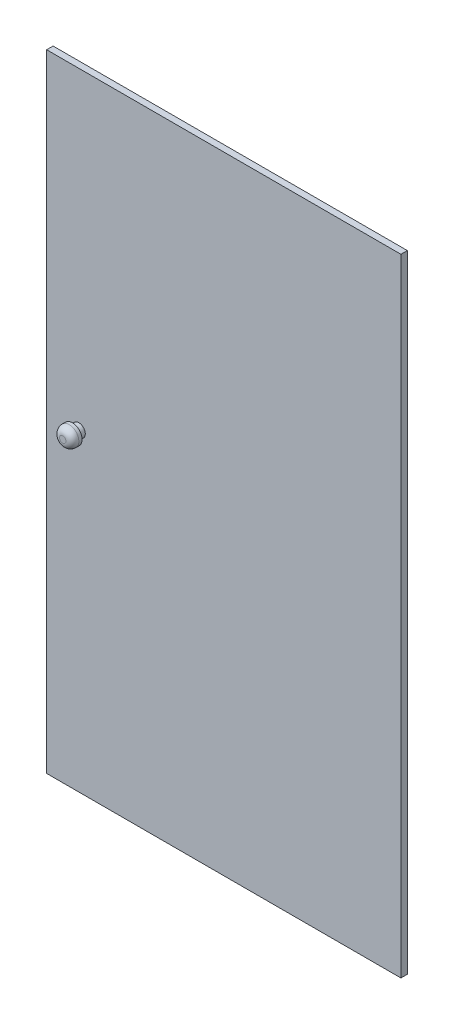
ISO-10303-21;
HEADER;
FILE_DESCRIPTION(('STEP AP214'),'2;1');
FILE_NAME('part.step','',(''),(''),'','','');
FILE_SCHEMA(('AUTOMOTIVE_DESIGN { 1 0 10303 214 1 1 1 1 }'));
ENDSEC;
DATA;
#1=APPLICATION_CONTEXT('core data for automotive mechanical design processes');
#2=APPLICATION_PROTOCOL_DEFINITION('international standard','automotive_design',2000,#1);
#3=PRODUCT_CONTEXT('',#1,'mechanical');
#4=PRODUCT('Part','Part','',(#3));
#5=PRODUCT_RELATED_PRODUCT_CATEGORY('part','',(#4));
#6=PRODUCT_DEFINITION_FORMATION('','',#4);
#7=PRODUCT_DEFINITION_CONTEXT('part definition',#1,'design');
#8=PRODUCT_DEFINITION('design','',#6,#7);
#9=PRODUCT_DEFINITION_SHAPE('','',#8);
#10=(LENGTH_UNIT() NAMED_UNIT(*) SI_UNIT(.MILLI.,.METRE.));
#11=(NAMED_UNIT(*) PLANE_ANGLE_UNIT() SI_UNIT($,.RADIAN.));
#12=(NAMED_UNIT(*) SI_UNIT($,.STERADIAN.) SOLID_ANGLE_UNIT());
#13=UNCERTAINTY_MEASURE_WITH_UNIT(LENGTH_MEASURE(1.E-05),#10,'distance_accuracy_value','');
#14=(GEOMETRIC_REPRESENTATION_CONTEXT(3) GLOBAL_UNCERTAINTY_ASSIGNED_CONTEXT((#13)) GLOBAL_UNIT_ASSIGNED_CONTEXT((#10,
#11,#12)) REPRESENTATION_CONTEXT('',''));
#15=CARTESIAN_POINT('',(0.,0.,0.));
#16=DIRECTION('',(0.,0.,1.));
#17=DIRECTION('',(1.,0.,0.));
#18=AXIS2_PLACEMENT_3D('',#15,#16,#17);
#19=CARTESIAN_POINT('',(-275.,-486.5,10.));
#20=DIRECTION('',(1.,0.,0.));
#21=DIRECTION('',(0.,0.,-1.));
#22=AXIS2_PLACEMENT_3D('',#19,#20,#21);
#23=PLANE('',#22);
#24=DIRECTION('',(0.,-1.,0.));
#25=VECTOR('',#24,1.);
#26=CARTESIAN_POINT('',(-275.,-486.5,0.));
#27=LINE('',#26,#25);
#28=CARTESIAN_POINT('',(-275.,486.5,0.));
#29=VERTEX_POINT('',#28);
#30=CARTESIAN_POINT('',(-275.,-486.5,0.));
#31=VERTEX_POINT('',#30);
#32=EDGE_CURVE('E102',#29,#31,#27,.T.);
#33=ORIENTED_EDGE('',*,*,#32,.T.);
#34=DIRECTION('',(0.,0.,-1.));
#35=VECTOR('',#34,1.);
#36=CARTESIAN_POINT('',(-275.,-486.5,10.));
#37=LINE('',#36,#35);
#38=CARTESIAN_POINT('',(-275.,-486.5,10.));
#39=VERTEX_POINT('',#38);
#40=EDGE_CURVE('E93',#39,#31,#37,.T.);
#41=ORIENTED_EDGE('',*,*,#40,.F.);
#42=DIRECTION('',(0.,-1.,0.));
#43=VECTOR('',#42,1.);
#44=CARTESIAN_POINT('',(-275.,-486.5,10.));
#45=LINE('',#44,#43);
#46=CARTESIAN_POINT('',(-275.,486.5,10.));
#47=VERTEX_POINT('',#46);
#48=EDGE_CURVE('E87',#47,#39,#45,.T.);
#49=ORIENTED_EDGE('',*,*,#48,.F.);
#50=DIRECTION('',(0.,0.,-1.));
#51=VECTOR('',#50,1.);
#52=CARTESIAN_POINT('',(-275.,486.5,10.));
#53=LINE('',#52,#51);
#54=EDGE_CURVE('E98',#47,#29,#53,.T.);
#55=ORIENTED_EDGE('',*,*,#54,.T.);
#56=EDGE_LOOP('',(#33,#41,#49,#55));
#57=FACE_BOUND('',#56,.T.);
#58=ADVANCED_FACE('F34',(#57),#23,.F.);
#59=CARTESIAN_POINT('',(275.,-486.5,10.));
#60=DIRECTION('',(0.,1.,0.));
#61=DIRECTION('',(-1.,0.,0.));
#62=AXIS2_PLACEMENT_3D('',#59,#60,#61);
#63=PLANE('',#62);
#64=DIRECTION('',(1.,0.,0.));
#65=VECTOR('',#64,1.);
#66=CARTESIAN_POINT('',(275.,-486.5,0.));
#67=LINE('',#66,#65);
#68=CARTESIAN_POINT('',(275.,-486.5,0.));
#69=VERTEX_POINT('',#68);
#70=EDGE_CURVE('E92',#31,#69,#67,.T.);
#71=ORIENTED_EDGE('',*,*,#70,.T.);
#72=DIRECTION('',(0.,0.,-1.));
#73=VECTOR('',#72,1.);
#74=CARTESIAN_POINT('',(275.,-486.5,10.));
#75=LINE('',#74,#73);
#76=CARTESIAN_POINT('',(275.,-486.5,10.));
#77=VERTEX_POINT('',#76);
#78=EDGE_CURVE('E90',#77,#69,#75,.T.);
#79=ORIENTED_EDGE('',*,*,#78,.F.);
#80=DIRECTION('',(1.,0.,0.));
#81=VECTOR('',#80,1.);
#82=CARTESIAN_POINT('',(275.,-486.5,10.));
#83=LINE('',#82,#81);
#84=EDGE_CURVE('E82',#39,#77,#83,.T.);
#85=ORIENTED_EDGE('',*,*,#84,.F.);
#86=ORIENTED_EDGE('',*,*,#40,.T.);
#87=EDGE_LOOP('',(#71,#79,#85,#86));
#88=FACE_BOUND('',#87,.T.);
#89=ADVANCED_FACE('F91',(#88),#63,.F.);
#90=CARTESIAN_POINT('',(275.,-486.5,10.));
#91=DIRECTION('',(-1.,0.,0.));
#92=DIRECTION('',(0.,0.,1.));
#93=AXIS2_PLACEMENT_3D('',#90,#91,#92);
#94=PLANE('',#93);
#95=DIRECTION('',(0.,1.,0.));
#96=VECTOR('',#95,1.);
#97=CARTESIAN_POINT('',(275.,-486.5,0.));
#98=LINE('',#97,#96);
#99=CARTESIAN_POINT('',(275.,486.5,0.));
#100=VERTEX_POINT('',#99);
#101=EDGE_CURVE('E68',#69,#100,#98,.T.);
#102=ORIENTED_EDGE('',*,*,#101,.T.);
#103=DIRECTION('',(0.,0.,-1.));
#104=VECTOR('',#103,1.);
#105=CARTESIAN_POINT('',(275.,486.5,10.));
#106=LINE('',#105,#104);
#107=CARTESIAN_POINT('',(275.,486.5,10.));
#108=VERTEX_POINT('',#107);
#109=EDGE_CURVE('E94',#108,#100,#106,.T.);
#110=ORIENTED_EDGE('',*,*,#109,.F.);
#111=DIRECTION('',(0.,1.,0.));
#112=VECTOR('',#111,1.);
#113=CARTESIAN_POINT('',(275.,-486.5,10.));
#114=LINE('',#113,#112);
#115=EDGE_CURVE('E85',#77,#108,#114,.T.);
#116=ORIENTED_EDGE('',*,*,#115,.F.);
#117=ORIENTED_EDGE('',*,*,#78,.T.);
#118=EDGE_LOOP('',(#102,#110,#116,#117));
#119=FACE_BOUND('',#118,.T.);
#120=ADVANCED_FACE('F96',(#119),#94,.F.);
#121=CARTESIAN_POINT('',(275.,486.5,10.));
#122=DIRECTION('',(0.,-1.,0.));
#123=DIRECTION('',(0.,0.,-1.));
#124=AXIS2_PLACEMENT_3D('',#121,#122,#123);
#125=PLANE('',#124);
#126=DIRECTION('',(-1.,0.,0.));
#127=VECTOR('',#126,1.);
#128=CARTESIAN_POINT('',(275.,486.5,0.));
#129=LINE('',#128,#127);
#130=EDGE_CURVE('E74',#100,#29,#129,.T.);
#131=ORIENTED_EDGE('',*,*,#130,.T.);
#132=ORIENTED_EDGE('',*,*,#54,.F.);
#133=DIRECTION('',(-1.,0.,0.));
#134=VECTOR('',#133,1.);
#135=CARTESIAN_POINT('',(275.,486.5,10.));
#136=LINE('',#135,#134);
#137=EDGE_CURVE('E51',#108,#47,#136,.T.);
#138=ORIENTED_EDGE('',*,*,#137,.F.);
#139=ORIENTED_EDGE('',*,*,#109,.T.);
#140=EDGE_LOOP('',(#131,#132,#138,#139));
#141=FACE_BOUND('',#140,.T.);
#142=ADVANCED_FACE('F134',(#141),#125,.F.);
#143=CARTESIAN_POINT('',(0.,0.,10.));
#144=DIRECTION('',(0.,0.,1.));
#145=DIRECTION('',(1.,0.,0.));
#146=AXIS2_PLACEMENT_3D('',#143,#144,#145);
#147=PLANE('',#146);
#148=CARTESIAN_POINT('',(-225.,-2.22044604925031E-13,10.));
#149=DIRECTION('',(0.,0.,1.));
#150=DIRECTION('',(1.,0.,0.));
#151=AXIS2_PLACEMENT_3D('',#148,#149,#150);
#152=CIRCLE('',#151,10.);
#153=CARTESIAN_POINT('',(-215.,-2.22044604925031E-13,10.));
#154=VERTEX_POINT('',#153);
#155=EDGE_CURVE('E222',#154,#154,#152,.T.);
#156=ORIENTED_EDGE('',*,*,#155,.F.);
#157=EDGE_LOOP('',(#156));
#158=FACE_BOUND('',#157,.T.);
#159=ORIENTED_EDGE('',*,*,#48,.T.);
#160=ORIENTED_EDGE('',*,*,#84,.T.);
#161=ORIENTED_EDGE('',*,*,#115,.T.);
#162=ORIENTED_EDGE('',*,*,#137,.T.);
#163=EDGE_LOOP('',(#159,#160,#161,#162));
#164=FACE_BOUND('',#163,.T.);
#165=ADVANCED_FACE('F83',(#158,#164),#147,.T.);
#166=CARTESIAN_POINT('',(0.,0.,0.));
#167=DIRECTION('',(0.,0.,1.));
#168=DIRECTION('',(1.,0.,0.));
#169=AXIS2_PLACEMENT_3D('',#166,#167,#168);
#170=PLANE('',#169);
#171=ORIENTED_EDGE('',*,*,#32,.F.);
#172=ORIENTED_EDGE('',*,*,#130,.F.);
#173=ORIENTED_EDGE('',*,*,#101,.F.);
#174=ORIENTED_EDGE('',*,*,#70,.F.);
#175=EDGE_LOOP('',(#171,#172,#173,#174));
#176=FACE_BOUND('',#175,.T.);
#177=ADVANCED_FACE('F137',(#176),#170,.F.);
#178=CARTESIAN_POINT('',(-225.,-2.22044604925031E-13,20.));
#179=DIRECTION('',(0.,0.,-1.));
#180=DIRECTION('',(-1.,0.,0.));
#181=AXIS2_PLACEMENT_3D('',#178,#179,#180);
#182=CYLINDRICAL_SURFACE('',#181,10.);
#183=CARTESIAN_POINT('',(-225.,-2.22044604925031E-13,20.));
#184=DIRECTION('',(0.,0.,1.));
#185=DIRECTION('',(1.,0.,0.));
#186=AXIS2_PLACEMENT_3D('',#183,#184,#185);
#187=CIRCLE('',#186,10.);
#188=CARTESIAN_POINT('',(-215.,-2.22044604925031E-13,20.));
#189=VERTEX_POINT('',#188);
#190=EDGE_CURVE('E105',#189,#189,#187,.T.);
#191=ORIENTED_EDGE('',*,*,#190,.F.);
#192=EDGE_LOOP('',(#191));
#193=FACE_BOUND('',#192,.T.);
#194=ORIENTED_EDGE('',*,*,#155,.T.);
#195=EDGE_LOOP('',(#194));
#196=FACE_BOUND('',#195,.T.);
#197=ADVANCED_FACE('F140',(#193,#196),#182,.T.);
#198=CARTESIAN_POINT('',(-225.,-2.22044604925031E-13,35.));
#199=DIRECTION('',(0.,0.,-1.));
#200=DIRECTION('',(-1.,0.,0.));
#201=AXIS2_PLACEMENT_3D('',#198,#199,#200);
#202=CYLINDRICAL_SURFACE('',#201,15.);
#203=CARTESIAN_POINT('',(-225.,-2.22044604925031E-13,25.));
#204=DIRECTION('',(0.,0.,1.));
#205=DIRECTION('',(1.,0.,0.));
#206=AXIS2_PLACEMENT_3D('',#203,#204,#205);
#207=CIRCLE('',#206,15.);
#208=CARTESIAN_POINT('',(-210.,-2.22044604925031E-13,25.));
#209=VERTEX_POINT('',#208);
#210=EDGE_CURVE('E11',#209,#209,#207,.F.);
#211=ORIENTED_EDGE('',*,*,#210,.T.);
#212=EDGE_LOOP('',(#211));
#213=FACE_BOUND('',#212,.T.);
#214=CARTESIAN_POINT('',(-225.,-2.22044604925031E-13,20.));
#215=DIRECTION('',(0.,0.,1.));
#216=DIRECTION('',(1.,0.,0.));
#217=AXIS2_PLACEMENT_3D('',#214,#215,#216);
#218=CIRCLE('',#217,15.);
#219=CARTESIAN_POINT('',(-210.,-2.22044604925031E-13,20.));
#220=VERTEX_POINT('',#219);
#221=EDGE_CURVE('E220',#220,#220,#218,.T.);
#222=ORIENTED_EDGE('',*,*,#221,.T.);
#223=EDGE_LOOP('',(#222));
#224=FACE_BOUND('',#223,.T.);
#225=ADVANCED_FACE('F147',(#213,#224),#202,.T.);
#226=CARTESIAN_POINT('',(-225.,-2.22044604925031E-13,35.));
#227=DIRECTION('',(0.,0.,1.));
#228=DIRECTION('',(1.,0.,0.));
#229=AXIS2_PLACEMENT_3D('',#226,#227,#228);
#230=PLANE('',#229);
#231=CARTESIAN_POINT('',(-225.,-2.22044604925031E-13,35.));
#232=DIRECTION('',(0.,0.,1.));
#233=DIRECTION('',(1.,0.,0.));
#234=AXIS2_PLACEMENT_3D('',#231,#232,#233);
#235=CIRCLE('',#234,5.00000000000002);
#236=CARTESIAN_POINT('',(-220.,-2.22044604925031E-13,35.));
#237=VERTEX_POINT('',#236);
#238=EDGE_CURVE('E43',#237,#237,#235,.T.);
#239=ORIENTED_EDGE('',*,*,#238,.T.);
#240=EDGE_LOOP('',(#239));
#241=FACE_BOUND('',#240,.T.);
#242=ADVANCED_FACE('F114',(#241),#230,.T.);
#243=CARTESIAN_POINT('',(-225.,-2.22044604925031E-13,20.));
#244=DIRECTION('',(0.,0.,1.));
#245=DIRECTION('',(1.,0.,0.));
#246=AXIS2_PLACEMENT_3D('',#243,#244,#245);
#247=PLANE('',#246);
#248=ORIENTED_EDGE('',*,*,#190,.T.);
#249=EDGE_LOOP('',(#248));
#250=FACE_BOUND('',#249,.T.);
#251=ORIENTED_EDGE('',*,*,#221,.F.);
#252=EDGE_LOOP('',(#251));
#253=FACE_BOUND('',#252,.T.);
#254=ADVANCED_FACE('F117',(#250,#253),#247,.F.);
#255=CARTESIAN_POINT('',(-225.,-2.22044604925031E-13,25.));
#256=DIRECTION('',(0.,0.,1.));
#257=DIRECTION('',(1.,0.,0.));
#258=AXIS2_PLACEMENT_3D('',#255,#256,#257);
#259=DEGENERATE_TOROIDAL_SURFACE('',#258,5.00000000000002,10.,.T.);
#260=ORIENTED_EDGE('',*,*,#210,.F.);
#261=EDGE_LOOP('',(#260));
#262=FACE_BOUND('',#261,.T.);
#263=ORIENTED_EDGE('',*,*,#238,.F.);
#264=EDGE_LOOP('',(#263));
#265=FACE_BOUND('',#264,.T.);
#266=ADVANCED_FACE('F36',(#262,#265),#259,.T.);
#267=CLOSED_SHELL('',(#58,#89,#120,#142,#165,#177,#197,#225,#242,#254,#266));
#268=MANIFOLD_SOLID_BREP('B2',#267);
#269=ADVANCED_BREP_SHAPE_REPRESENTATION('',(#18,#268),#14);
#270=SHAPE_DEFINITION_REPRESENTATION(#9,#269);
ENDSEC;
END-ISO-10303-21;
